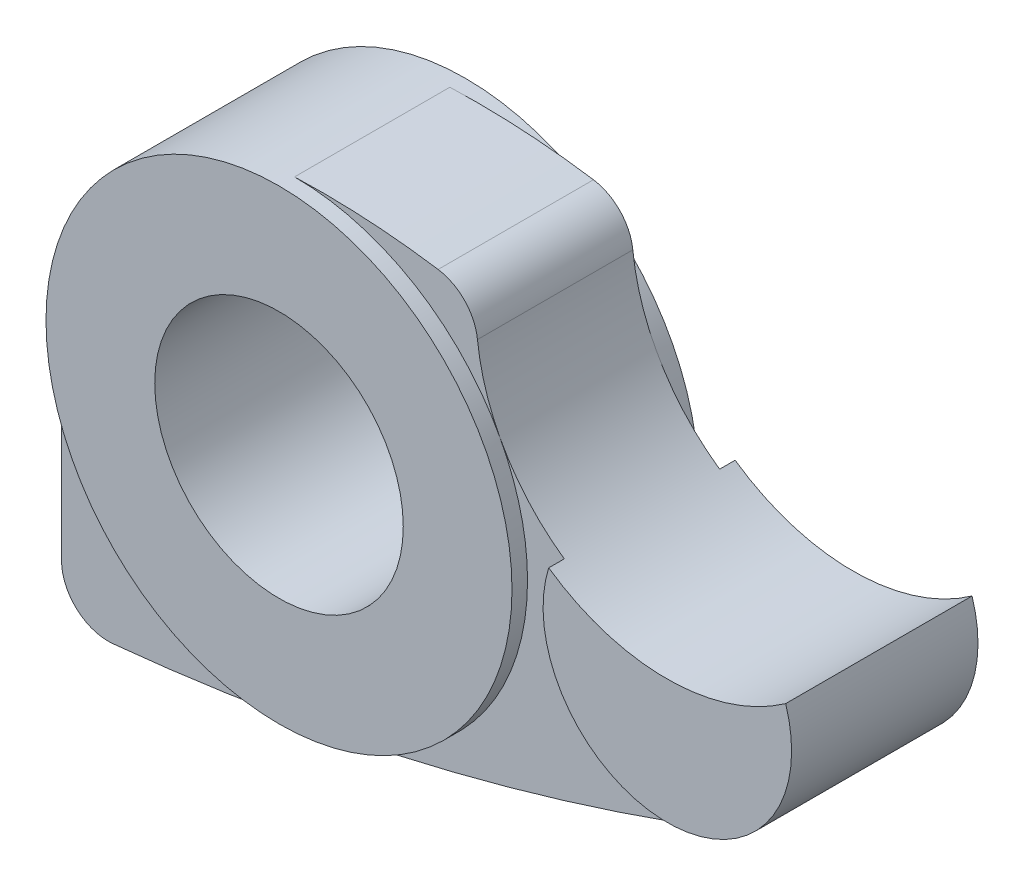
ISO-10303-21;
HEADER;
FILE_DESCRIPTION(('STEP AP214'),'2;1');
FILE_NAME('part.step','',(''),(''),'','','');
FILE_SCHEMA(('AUTOMOTIVE_DESIGN { 1 0 10303 214 1 1 1 1 }'));
ENDSEC;
DATA;
#1=APPLICATION_CONTEXT('core data for automotive mechanical design processes');
#2=APPLICATION_PROTOCOL_DEFINITION('international standard','automotive_design',2000,#1);
#3=PRODUCT_CONTEXT('',#1,'mechanical');
#4=PRODUCT('Part','Part','',(#3));
#5=PRODUCT_RELATED_PRODUCT_CATEGORY('part','',(#4));
#6=PRODUCT_DEFINITION_FORMATION('','',#4);
#7=PRODUCT_DEFINITION_CONTEXT('part definition',#1,'design');
#8=PRODUCT_DEFINITION('design','',#6,#7);
#9=PRODUCT_DEFINITION_SHAPE('','',#8);
#10=(LENGTH_UNIT() NAMED_UNIT(*) SI_UNIT(.MILLI.,.METRE.));
#11=(NAMED_UNIT(*) PLANE_ANGLE_UNIT() SI_UNIT($,.RADIAN.));
#12=(NAMED_UNIT(*) SI_UNIT($,.STERADIAN.) SOLID_ANGLE_UNIT());
#13=UNCERTAINTY_MEASURE_WITH_UNIT(LENGTH_MEASURE(1.E-05),#10,'distance_accuracy_value','');
#14=(GEOMETRIC_REPRESENTATION_CONTEXT(3) GLOBAL_UNCERTAINTY_ASSIGNED_CONTEXT((#13)) GLOBAL_UNIT_ASSIGNED_CONTEXT((#10,
#11,#12)) REPRESENTATION_CONTEXT('',''));
#15=CARTESIAN_POINT('',(0.,0.,0.));
#16=DIRECTION('',(0.,0.,1.));
#17=DIRECTION('',(1.,0.,0.));
#18=AXIS2_PLACEMENT_3D('',#15,#16,#17);
#19=CARTESIAN_POINT('',(0.,0.,6.));
#20=DIRECTION('',(0.,0.,1.));
#21=DIRECTION('',(1.,0.,0.));
#22=AXIS2_PLACEMENT_3D('',#19,#20,#21);
#23=PLANE('',#22);
#24=CARTESIAN_POINT('',(0.,0.,6.));
#25=DIRECTION('',(0.,0.,1.));
#26=DIRECTION('',(1.,0.,0.));
#27=AXIS2_PLACEMENT_3D('',#24,#25,#26);
#28=CIRCLE('',#27,15.);
#29=CARTESIAN_POINT('',(15.,0.,6.));
#30=VERTEX_POINT('',#29);
#31=EDGE_CURVE('E12',#30,#30,#28,.T.);
#32=ORIENTED_EDGE('',*,*,#31,.T.);
#33=EDGE_LOOP('',(#32));
#34=FACE_BOUND('',#33,.T.);
#35=CARTESIAN_POINT('',(0.,0.,6.));
#36=DIRECTION('',(0.,0.,1.));
#37=DIRECTION('',(1.,0.,0.));
#38=AXIS2_PLACEMENT_3D('',#35,#36,#37);
#39=CIRCLE('',#38,8.);
#40=CARTESIAN_POINT('',(8.,0.,6.));
#41=VERTEX_POINT('',#40);
#42=EDGE_CURVE('E257',#41,#41,#39,.T.);
#43=ORIENTED_EDGE('',*,*,#42,.F.);
#44=EDGE_LOOP('',(#43));
#45=FACE_BOUND('',#44,.T.);
#46=ADVANCED_FACE('F65',(#34,#45),#23,.T.);
#47=CARTESIAN_POINT('',(0.,0.,-6.));
#48=DIRECTION('',(0.,0.,1.));
#49=DIRECTION('',(1.,0.,0.));
#50=AXIS2_PLACEMENT_3D('',#47,#48,#49);
#51=PLANE('',#50);
#52=CARTESIAN_POINT('',(0.,0.,-6.));
#53=DIRECTION('',(0.,0.,1.));
#54=DIRECTION('',(1.,0.,0.));
#55=AXIS2_PLACEMENT_3D('',#52,#53,#54);
#56=CIRCLE('',#55,15.);
#57=CARTESIAN_POINT('',(15.,0.,-6.));
#58=VERTEX_POINT('',#57);
#59=EDGE_CURVE('E69',#58,#58,#56,.T.);
#60=ORIENTED_EDGE('',*,*,#59,.F.);
#61=EDGE_LOOP('',(#60));
#62=FACE_BOUND('',#61,.T.);
#63=CARTESIAN_POINT('',(0.,0.,-6.));
#64=DIRECTION('',(0.,0.,1.));
#65=DIRECTION('',(1.,0.,0.));
#66=AXIS2_PLACEMENT_3D('',#63,#64,#65);
#67=CIRCLE('',#66,8.);
#68=CARTESIAN_POINT('',(8.,0.,-6.));
#69=VERTEX_POINT('',#68);
#70=EDGE_CURVE('E256',#69,#69,#67,.T.);
#71=ORIENTED_EDGE('',*,*,#70,.T.);
#72=EDGE_LOOP('',(#71));
#73=FACE_BOUND('',#72,.T.);
#74=ADVANCED_FACE('F263',(#62,#73),#51,.F.);
#75=CARTESIAN_POINT('',(0.,0.,6.));
#76=DIRECTION('',(0.,0.,-1.));
#77=DIRECTION('',(-1.,0.,0.));
#78=AXIS2_PLACEMENT_3D('',#75,#76,#77);
#79=CYLINDRICAL_SURFACE('',#78,15.);
#80=CARTESIAN_POINT('',(0.,0.,5.));
#81=DIRECTION('',(0.,0.,1.));
#82=DIRECTION('',(1.,0.,0.));
#83=AXIS2_PLACEMENT_3D('',#80,#81,#82);
#84=CIRCLE('',#83,15.);
#85=CARTESIAN_POINT('',(2.91999999999998,-14.713041833693,5.));
#86=VERTEX_POINT('',#85);
#87=CARTESIAN_POINT('',(13.2477876106195,7.03534813807513,5.));
#88=VERTEX_POINT('',#87);
#89=EDGE_CURVE('E234',#86,#88,#84,.T.);
#90=ORIENTED_EDGE('',*,*,#89,.T.);
#91=CARTESIAN_POINT('',(0.,0.,5.));
#92=DIRECTION('',(0.,0.,1.));
#93=DIRECTION('',(1.,0.,0.));
#94=AXIS2_PLACEMENT_3D('',#91,#92,#93);
#95=CIRCLE('',#94,15.);
#96=CARTESIAN_POINT('',(0.,15.,5.));
#97=VERTEX_POINT('',#96);
#98=EDGE_CURVE('E80',#88,#97,#95,.T.);
#99=ORIENTED_EDGE('',*,*,#98,.T.);
#100=DIRECTION('',(0.,0.,-1.));
#101=VECTOR('',#100,1.);
#102=CARTESIAN_POINT('',(0.,15.,5.));
#103=LINE('',#102,#101);
#104=CARTESIAN_POINT('',(0.,15.,-5.));
#105=VERTEX_POINT('',#104);
#106=EDGE_CURVE('E85',#97,#105,#103,.T.);
#107=ORIENTED_EDGE('',*,*,#106,.T.);
#108=CARTESIAN_POINT('',(0.,0.,-5.));
#109=DIRECTION('',(0.,0.,1.));
#110=DIRECTION('',(1.,0.,0.));
#111=AXIS2_PLACEMENT_3D('',#108,#109,#110);
#112=CIRCLE('',#111,15.);
#113=CARTESIAN_POINT('',(13.2477876106195,7.03534813807514,-5.));
#114=VERTEX_POINT('',#113);
#115=EDGE_CURVE('E176',#114,#105,#112,.T.);
#116=ORIENTED_EDGE('',*,*,#115,.F.);
#117=CARTESIAN_POINT('',(0.,0.,-5.));
#118=DIRECTION('',(0.,0.,1.));
#119=DIRECTION('',(1.,0.,0.));
#120=AXIS2_PLACEMENT_3D('',#117,#118,#119);
#121=CIRCLE('',#120,15.);
#122=CARTESIAN_POINT('',(2.91999999999999,-14.713041833693,-5.));
#123=VERTEX_POINT('',#122);
#124=EDGE_CURVE('E233',#123,#114,#121,.T.);
#125=ORIENTED_EDGE('',*,*,#124,.F.);
#126=CARTESIAN_POINT('',(0.,0.,-5.));
#127=DIRECTION('',(0.,0.,1.));
#128=DIRECTION('',(1.,0.,0.));
#129=AXIS2_PLACEMENT_3D('',#126,#127,#128);
#130=CIRCLE('',#129,15.);
#131=CARTESIAN_POINT('',(-15.,0.,-5.));
#132=VERTEX_POINT('',#131);
#133=EDGE_CURVE('E194',#132,#123,#130,.T.);
#134=ORIENTED_EDGE('',*,*,#133,.F.);
#135=DIRECTION('',(0.,0.,-1.));
#136=VECTOR('',#135,1.);
#137=CARTESIAN_POINT('',(-15.,0.,5.));
#138=LINE('',#137,#136);
#139=CARTESIAN_POINT('',(-15.,0.,5.));
#140=VERTEX_POINT('',#139);
#141=EDGE_CURVE('E201',#140,#132,#138,.T.);
#142=ORIENTED_EDGE('',*,*,#141,.F.);
#143=CARTESIAN_POINT('',(0.,0.,5.));
#144=DIRECTION('',(0.,0.,1.));
#145=DIRECTION('',(1.,0.,0.));
#146=AXIS2_PLACEMENT_3D('',#143,#144,#145);
#147=CIRCLE('',#146,15.);
#148=EDGE_CURVE('E198',#140,#86,#147,.T.);
#149=ORIENTED_EDGE('',*,*,#148,.T.);
#150=EDGE_LOOP('',(#90,#99,#107,#116,#125,#134,#142,#149));
#151=FACE_BOUND('',#150,.T.);
#152=ORIENTED_EDGE('',*,*,#31,.F.);
#153=EDGE_LOOP('',(#152));
#154=FACE_BOUND('',#153,.T.);
#155=ORIENTED_EDGE('',*,*,#59,.T.);
#156=EDGE_LOOP('',(#155));
#157=FACE_BOUND('',#156,.T.);
#158=ADVANCED_FACE('F67',(#151,#154,#157),#79,.T.);
#159=CARTESIAN_POINT('',(0.,0.,6.));
#160=DIRECTION('',(0.,0.,-1.));
#161=DIRECTION('',(-1.,0.,0.));
#162=AXIS2_PLACEMENT_3D('',#159,#160,#161);
#163=CYLINDRICAL_SURFACE('',#162,8.);
#164=ORIENTED_EDGE('',*,*,#42,.T.);
#165=EDGE_LOOP('',(#164));
#166=FACE_BOUND('',#165,.T.);
#167=ORIENTED_EDGE('',*,*,#70,.F.);
#168=EDGE_LOOP('',(#167));
#169=FACE_BOUND('',#168,.T.);
#170=ADVANCED_FACE('F265',(#166,#169),#163,.F.);
#171=CARTESIAN_POINT('',(-26.2799999999999,132.417376503237,5.));
#172=DIRECTION('',(0.,0.,-1.));
#173=DIRECTION('',(-1.,0.,0.));
#174=AXIS2_PLACEMENT_3D('',#171,#172,#173);
#175=CYLINDRICAL_SURFACE('',#174,150.);
#176=CARTESIAN_POINT('',(-26.2799999999999,132.417376503237,-5.));
#177=DIRECTION('',(0.,0.,1.));
#178=DIRECTION('',(1.,0.,0.));
#179=AXIS2_PLACEMENT_3D('',#176,#177,#178);
#180=CIRCLE('',#179,150.);
#181=CARTESIAN_POINT('',(27.889014084507,-7.46013388750627,-5.));
#182=VERTEX_POINT('',#181);
#183=EDGE_CURVE('E247',#123,#182,#180,.T.);
#184=ORIENTED_EDGE('',*,*,#183,.T.);
#185=DIRECTION('',(0.,0.,-1.));
#186=VECTOR('',#185,1.);
#187=CARTESIAN_POINT('',(27.889014084507,-7.46013388750627,5.));
#188=LINE('',#187,#186);
#189=CARTESIAN_POINT('',(27.8890140845071,-7.46013388750624,5.));
#190=VERTEX_POINT('',#189);
#191=EDGE_CURVE('E244',#190,#182,#188,.T.);
#192=ORIENTED_EDGE('',*,*,#191,.F.);
#193=CARTESIAN_POINT('',(-26.2799999999999,132.417376503237,5.));
#194=DIRECTION('',(0.,0.,1.));
#195=DIRECTION('',(1.,0.,0.));
#196=AXIS2_PLACEMENT_3D('',#193,#194,#195);
#197=CIRCLE('',#196,150.);
#198=EDGE_CURVE('E236',#86,#190,#197,.T.);
#199=ORIENTED_EDGE('',*,*,#198,.F.);
#200=CARTESIAN_POINT('',(-26.2799999999999,132.417376503237,5.));
#201=DIRECTION('',(0.,0.,1.));
#202=DIRECTION('',(1.,0.,0.));
#203=AXIS2_PLACEMENT_3D('',#200,#201,#202);
#204=CIRCLE('',#203,150.);
#205=CARTESIAN_POINT('',(-11.7085714285714,-16.8731907452927,5.));
#206=VERTEX_POINT('',#205);
#207=EDGE_CURVE('E196',#206,#86,#204,.T.);
#208=ORIENTED_EDGE('',*,*,#207,.F.);
#209=DIRECTION('',(0.,0.,-1.));
#210=VECTOR('',#209,1.);
#211=CARTESIAN_POINT('',(-11.7085714285714,-16.8731907452927,5.));
#212=LINE('',#211,#210);
#213=CARTESIAN_POINT('',(-11.7085714285714,-16.8731907452927,-5.));
#214=VERTEX_POINT('',#213);
#215=EDGE_CURVE('E211',#206,#214,#212,.T.);
#216=ORIENTED_EDGE('',*,*,#215,.T.);
#217=CARTESIAN_POINT('',(-26.2799999999999,132.417376503237,-5.));
#218=DIRECTION('',(0.,0.,1.));
#219=DIRECTION('',(1.,0.,0.));
#220=AXIS2_PLACEMENT_3D('',#217,#218,#219);
#221=CIRCLE('',#220,150.);
#222=EDGE_CURVE('E206',#214,#123,#221,.T.);
#223=ORIENTED_EDGE('',*,*,#222,.T.);
#224=EDGE_LOOP('',(#184,#192,#199,#208,#216,#223));
#225=FACE_BOUND('',#224,.T.);
#226=ADVANCED_FACE('F267',(#225),#175,.T.);
#227=CARTESIAN_POINT('',(24.95,13.2499056600415,5.));
#228=DIRECTION('',(0.,0.,-1.));
#229=DIRECTION('',(-1.,0.,0.));
#230=AXIS2_PLACEMENT_3D('',#227,#228,#229);
#231=CYLINDRICAL_SURFACE('',#230,13.25);
#232=CARTESIAN_POINT('',(24.95,13.2499056600415,-5.));
#233=DIRECTION('',(0.,0.,1.));
#234=DIRECTION('',(1.,0.,0.));
#235=AXIS2_PLACEMENT_3D('',#232,#233,#234);
#236=CIRCLE('',#235,13.25);
#237=CARTESIAN_POINT('',(17.3641904918523,2.38629695454703,-5.));
#238=VERTEX_POINT('',#237);
#239=EDGE_CURVE('E237',#114,#238,#236,.T.);
#240=ORIENTED_EDGE('',*,*,#239,.F.);
#241=CARTESIAN_POINT('',(24.95,13.2499056600415,-5.));
#242=DIRECTION('',(0.,0.,1.));
#243=DIRECTION('',(1.,0.,0.));
#244=AXIS2_PLACEMENT_3D('',#241,#242,#243);
#245=CIRCLE('',#244,13.25);
#246=CARTESIAN_POINT('',(11.7772750679011,11.8209837366115,-5.));
#247=VERTEX_POINT('',#246);
#248=EDGE_CURVE('E161',#247,#114,#245,.T.);
#249=ORIENTED_EDGE('',*,*,#248,.F.);
#250=DIRECTION('',(0.,0.,-1.));
#251=VECTOR('',#250,1.);
#252=CARTESIAN_POINT('',(11.7772750679011,11.8209837366115,5.));
#253=LINE('',#252,#251);
#254=CARTESIAN_POINT('',(11.7772750679011,11.8209837366115,5.));
#255=VERTEX_POINT('',#254);
#256=EDGE_CURVE('E154',#255,#247,#253,.T.);
#257=ORIENTED_EDGE('',*,*,#256,.F.);
#258=CARTESIAN_POINT('',(24.95,13.2499056600415,5.));
#259=DIRECTION('',(0.,0.,1.));
#260=DIRECTION('',(1.,0.,0.));
#261=AXIS2_PLACEMENT_3D('',#258,#259,#260);
#262=CIRCLE('',#261,13.25);
#263=EDGE_CURVE('E159',#255,#88,#262,.T.);
#264=ORIENTED_EDGE('',*,*,#263,.T.);
#265=CARTESIAN_POINT('',(24.95,13.2499056600415,5.));
#266=DIRECTION('',(0.,0.,1.));
#267=DIRECTION('',(1.,0.,0.));
#268=AXIS2_PLACEMENT_3D('',#265,#266,#267);
#269=CIRCLE('',#268,13.25);
#270=CARTESIAN_POINT('',(17.3641904918523,2.38629695454703,5.));
#271=VERTEX_POINT('',#270);
#272=EDGE_CURVE('E242',#88,#271,#269,.T.);
#273=ORIENTED_EDGE('',*,*,#272,.T.);
#274=DIRECTION('',(0.,0.,-1.));
#275=VECTOR('',#274,1.);
#276=CARTESIAN_POINT('',(17.3641904918523,2.38629695454703,6.));
#277=LINE('',#276,#275);
#278=CARTESIAN_POINT('',(17.3641904918523,2.38629695454703,6.));
#279=VERTEX_POINT('',#278);
#280=EDGE_CURVE('E231',#279,#271,#277,.T.);
#281=ORIENTED_EDGE('',*,*,#280,.F.);
#282=CARTESIAN_POINT('',(24.95,13.2499056600415,6.));
#283=DIRECTION('',(0.,0.,1.));
#284=DIRECTION('',(1.,0.,0.));
#285=AXIS2_PLACEMENT_3D('',#282,#283,#284);
#286=CIRCLE('',#285,13.25);
#287=CARTESIAN_POINT('',(32.6175823810563,2.44385733376998,6.));
#288=VERTEX_POINT('',#287);
#289=EDGE_CURVE('E218',#279,#288,#286,.T.);
#290=ORIENTED_EDGE('',*,*,#289,.T.);
#291=DIRECTION('',(0.,0.,-1.));
#292=VECTOR('',#291,1.);
#293=CARTESIAN_POINT('',(32.6175823810563,2.44385733376998,6.));
#294=LINE('',#293,#292);
#295=CARTESIAN_POINT('',(32.6175823810563,2.44385733376998,-6.));
#296=VERTEX_POINT('',#295);
#297=EDGE_CURVE('E224',#288,#296,#294,.T.);
#298=ORIENTED_EDGE('',*,*,#297,.T.);
#299=CARTESIAN_POINT('',(24.95,13.2499056600415,-6.));
#300=DIRECTION('',(0.,0.,1.));
#301=DIRECTION('',(1.,0.,0.));
#302=AXIS2_PLACEMENT_3D('',#299,#300,#301);
#303=CIRCLE('',#302,13.25);
#304=CARTESIAN_POINT('',(17.3641904918523,2.38629695454703,-6.));
#305=VERTEX_POINT('',#304);
#306=EDGE_CURVE('E217',#305,#296,#303,.T.);
#307=ORIENTED_EDGE('',*,*,#306,.F.);
#308=EDGE_CURVE('E230',#238,#305,#277,.T.);
#309=ORIENTED_EDGE('',*,*,#308,.F.);
#310=EDGE_LOOP('',(#240,#249,#257,#264,#273,#281,#290,#298,#307,#309));
#311=FACE_BOUND('',#310,.T.);
#312=ADVANCED_FACE('F156',(#311),#231,.F.);
#313=CARTESIAN_POINT('',(0.,0.,5.));
#314=DIRECTION('',(0.,0.,1.));
#315=DIRECTION('',(1.,0.,0.));
#316=AXIS2_PLACEMENT_3D('',#313,#314,#315);
#317=PLANE('',#316);
#318=ORIENTED_EDGE('',*,*,#89,.F.);
#319=ORIENTED_EDGE('',*,*,#198,.T.);
#320=CARTESIAN_POINT('',(25.,0.,5.));
#321=DIRECTION('',(0.,0.,1.));
#322=DIRECTION('',(1.,0.,0.));
#323=AXIS2_PLACEMENT_3D('',#320,#321,#322);
#324=CIRCLE('',#323,8.);
#325=EDGE_CURVE('E240',#271,#190,#324,.T.);
#326=ORIENTED_EDGE('',*,*,#325,.F.);
#327=ORIENTED_EDGE('',*,*,#272,.F.);
#328=EDGE_LOOP('',(#318,#319,#326,#327));
#329=FACE_BOUND('',#328,.T.);
#330=ADVANCED_FACE('F345',(#329),#317,.T.);
#331=CARTESIAN_POINT('',(0.,0.,-5.));
#332=DIRECTION('',(0.,0.,1.));
#333=DIRECTION('',(1.,0.,0.));
#334=AXIS2_PLACEMENT_3D('',#331,#332,#333);
#335=PLANE('',#334);
#336=ORIENTED_EDGE('',*,*,#124,.T.);
#337=ORIENTED_EDGE('',*,*,#239,.T.);
#338=CARTESIAN_POINT('',(25.,0.,-5.));
#339=DIRECTION('',(0.,0.,1.));
#340=DIRECTION('',(1.,0.,0.));
#341=AXIS2_PLACEMENT_3D('',#338,#339,#340);
#342=CIRCLE('',#341,8.);
#343=EDGE_CURVE('E250',#238,#182,#342,.T.);
#344=ORIENTED_EDGE('',*,*,#343,.T.);
#345=ORIENTED_EDGE('',*,*,#183,.F.);
#346=EDGE_LOOP('',(#336,#337,#344,#345));
#347=FACE_BOUND('',#346,.T.);
#348=ADVANCED_FACE('F317',(#347),#335,.F.);
#349=CARTESIAN_POINT('',(25.,0.,6.));
#350=DIRECTION('',(0.,0.,-1.));
#351=DIRECTION('',(-1.,0.,0.));
#352=AXIS2_PLACEMENT_3D('',#349,#350,#351);
#353=CYLINDRICAL_SURFACE('',#352,8.);
#354=ORIENTED_EDGE('',*,*,#325,.T.);
#355=ORIENTED_EDGE('',*,*,#191,.T.);
#356=ORIENTED_EDGE('',*,*,#343,.F.);
#357=ORIENTED_EDGE('',*,*,#308,.T.);
#358=CARTESIAN_POINT('',(25.,0.,-6.));
#359=DIRECTION('',(0.,0.,1.));
#360=DIRECTION('',(1.,0.,0.));
#361=AXIS2_PLACEMENT_3D('',#358,#359,#360);
#362=CIRCLE('',#361,8.);
#363=EDGE_CURVE('E222',#305,#296,#362,.T.);
#364=ORIENTED_EDGE('',*,*,#363,.T.);
#365=ORIENTED_EDGE('',*,*,#297,.F.);
#366=CARTESIAN_POINT('',(25.,0.,6.));
#367=DIRECTION('',(0.,0.,1.));
#368=DIRECTION('',(1.,0.,0.));
#369=AXIS2_PLACEMENT_3D('',#366,#367,#368);
#370=CIRCLE('',#369,8.);
#371=EDGE_CURVE('E221',#279,#288,#370,.T.);
#372=ORIENTED_EDGE('',*,*,#371,.F.);
#373=ORIENTED_EDGE('',*,*,#280,.T.);
#374=EDGE_LOOP('',(#354,#355,#356,#357,#364,#365,#372,#373));
#375=FACE_BOUND('',#374,.T.);
#376=ADVANCED_FACE('F311',(#375),#353,.T.);
#377=CARTESIAN_POINT('',(0.,0.,6.));
#378=DIRECTION('',(0.,0.,1.));
#379=DIRECTION('',(1.,0.,0.));
#380=AXIS2_PLACEMENT_3D('',#377,#378,#379);
#381=PLANE('',#380);
#382=ORIENTED_EDGE('',*,*,#289,.F.);
#383=ORIENTED_EDGE('',*,*,#371,.T.);
#384=EDGE_LOOP('',(#382,#383));
#385=FACE_BOUND('',#384,.T.);
#386=ADVANCED_FACE('F316',(#385),#381,.T.);
#387=CARTESIAN_POINT('',(0.,0.,-6.));
#388=DIRECTION('',(0.,0.,1.));
#389=DIRECTION('',(1.,0.,0.));
#390=AXIS2_PLACEMENT_3D('',#387,#388,#389);
#391=PLANE('',#390);
#392=ORIENTED_EDGE('',*,*,#306,.T.);
#393=ORIENTED_EDGE('',*,*,#363,.F.);
#394=EDGE_LOOP('',(#392,#393));
#395=FACE_BOUND('',#394,.T.);
#396=ADVANCED_FACE('F326',(#395),#391,.F.);
#397=CARTESIAN_POINT('',(-15.,0.,5.));
#398=DIRECTION('',(1.,0.,0.));
#399=DIRECTION('',(0.,1.,0.));
#400=AXIS2_PLACEMENT_3D('',#397,#398,#399);
#401=PLANE('',#400);
#402=DIRECTION('',(0.,-1.,0.));
#403=VECTOR('',#402,1.);
#404=CARTESIAN_POINT('',(-15.,0.,-5.));
#405=LINE('',#404,#403);
#406=CARTESIAN_POINT('',(-15.,-13.8873794003221,-5.));
#407=VERTEX_POINT('',#406);
#408=EDGE_CURVE('E164',#132,#407,#405,.T.);
#409=ORIENTED_EDGE('',*,*,#408,.T.);
#410=DIRECTION('',(0.,0.,-1.));
#411=VECTOR('',#410,1.);
#412=CARTESIAN_POINT('',(-15.,-13.8873794003221,5.));
#413=LINE('',#412,#411);
#414=CARTESIAN_POINT('',(-15.,-13.8873794003221,5.));
#415=VERTEX_POINT('',#414);
#416=EDGE_CURVE('E214',#415,#407,#413,.T.);
#417=ORIENTED_EDGE('',*,*,#416,.F.);
#418=DIRECTION('',(0.,-1.,0.));
#419=VECTOR('',#418,1.);
#420=CARTESIAN_POINT('',(-15.,0.,5.));
#421=LINE('',#420,#419);
#422=EDGE_CURVE('E190',#140,#415,#421,.T.);
#423=ORIENTED_EDGE('',*,*,#422,.F.);
#424=ORIENTED_EDGE('',*,*,#141,.T.);
#425=EDGE_LOOP('',(#409,#417,#423,#424));
#426=FACE_BOUND('',#425,.T.);
#427=ADVANCED_FACE('F335',(#426),#401,.F.);
#428=CARTESIAN_POINT('',(-12.,-13.8873794003221,5.));
#429=DIRECTION('',(0.,0.,-1.));
#430=DIRECTION('',(-1.,0.,0.));
#431=AXIS2_PLACEMENT_3D('',#428,#429,#430);
#432=CYLINDRICAL_SURFACE('',#431,3.);
#433=CARTESIAN_POINT('',(-12.,-13.8873794003221,-5.));
#434=DIRECTION('',(0.,0.,1.));
#435=DIRECTION('',(1.,0.,0.));
#436=AXIS2_PLACEMENT_3D('',#433,#434,#435);
#437=CIRCLE('',#436,3.);
#438=EDGE_CURVE('E204',#407,#214,#437,.T.);
#439=ORIENTED_EDGE('',*,*,#438,.T.);
#440=ORIENTED_EDGE('',*,*,#215,.F.);
#441=CARTESIAN_POINT('',(-12.,-13.8873794003221,5.));
#442=DIRECTION('',(0.,0.,1.));
#443=DIRECTION('',(1.,0.,0.));
#444=AXIS2_PLACEMENT_3D('',#441,#442,#443);
#445=CIRCLE('',#444,3.);
#446=EDGE_CURVE('E193',#415,#206,#445,.T.);
#447=ORIENTED_EDGE('',*,*,#446,.F.);
#448=ORIENTED_EDGE('',*,*,#416,.T.);
#449=EDGE_LOOP('',(#439,#440,#447,#448));
#450=FACE_BOUND('',#449,.T.);
#451=ADVANCED_FACE('F385',(#450),#432,.T.);
#452=CARTESIAN_POINT('',(0.,0.,5.));
#453=DIRECTION('',(0.,0.,1.));
#454=DIRECTION('',(1.,0.,0.));
#455=AXIS2_PLACEMENT_3D('',#452,#453,#454);
#456=PLANE('',#455);
#457=ORIENTED_EDGE('',*,*,#422,.T.);
#458=ORIENTED_EDGE('',*,*,#446,.T.);
#459=ORIENTED_EDGE('',*,*,#207,.T.);
#460=ORIENTED_EDGE('',*,*,#148,.F.);
#461=EDGE_LOOP('',(#457,#458,#459,#460));
#462=FACE_BOUND('',#461,.T.);
#463=ADVANCED_FACE('F394',(#462),#456,.T.);
#464=CARTESIAN_POINT('',(0.,0.,-5.));
#465=DIRECTION('',(0.,0.,1.));
#466=DIRECTION('',(1.,0.,0.));
#467=AXIS2_PLACEMENT_3D('',#464,#465,#466);
#468=PLANE('',#467);
#469=ORIENTED_EDGE('',*,*,#408,.F.);
#470=ORIENTED_EDGE('',*,*,#133,.T.);
#471=ORIENTED_EDGE('',*,*,#222,.F.);
#472=ORIENTED_EDGE('',*,*,#438,.F.);
#473=EDGE_LOOP('',(#469,#470,#471,#472));
#474=FACE_BOUND('',#473,.T.);
#475=ADVANCED_FACE('F403',(#474),#468,.F.);
#476=CARTESIAN_POINT('',(8.79477130968997,11.4974542445141,5.));
#477=DIRECTION('',(0.,0.,-1.));
#478=DIRECTION('',(-1.,0.,0.));
#479=AXIS2_PLACEMENT_3D('',#476,#477,#478);
#480=CYLINDRICAL_SURFACE('',#479,3.);
#481=CARTESIAN_POINT('',(8.79477130968997,11.4974542445141,-5.));
#482=DIRECTION('',(0.,0.,1.));
#483=DIRECTION('',(1.,0.,0.));
#484=AXIS2_PLACEMENT_3D('',#481,#482,#483);
#485=CIRCLE('',#484,3.);
#486=CARTESIAN_POINT('',(9.24519508911452,14.4634479091953,-5.));
#487=VERTEX_POINT('',#486);
#488=EDGE_CURVE('E185',#247,#487,#485,.T.);
#489=ORIENTED_EDGE('',*,*,#488,.T.);
#490=DIRECTION('',(0.,0.,-1.));
#491=VECTOR('',#490,1.);
#492=CARTESIAN_POINT('',(9.24519508911452,14.4634479091953,5.));
#493=LINE('',#492,#491);
#494=CARTESIAN_POINT('',(9.24519508911452,14.4634479091953,5.));
#495=VERTEX_POINT('',#494);
#496=EDGE_CURVE('E165',#495,#487,#493,.T.);
#497=ORIENTED_EDGE('',*,*,#496,.F.);
#498=CARTESIAN_POINT('',(8.79477130968997,11.4974542445141,5.));
#499=DIRECTION('',(0.,0.,1.));
#500=DIRECTION('',(1.,0.,0.));
#501=AXIS2_PLACEMENT_3D('',#498,#499,#500);
#502=CIRCLE('',#501,3.);
#503=EDGE_CURVE('E168',#255,#495,#502,.T.);
#504=ORIENTED_EDGE('',*,*,#503,.F.);
#505=ORIENTED_EDGE('',*,*,#256,.T.);
#506=EDGE_LOOP('',(#489,#497,#504,#505));
#507=FACE_BOUND('',#506,.T.);
#508=ADVANCED_FACE('F169',(#507),#480,.T.);
#509=CARTESIAN_POINT('',(1.73813209870536,-34.9697798354911,5.));
#510=DIRECTION('',(0.,0.,-1.));
#511=DIRECTION('',(-1.,0.,0.));
#512=AXIS2_PLACEMENT_3D('',#509,#510,#511);
#513=CYLINDRICAL_SURFACE('',#512,50.);
#514=CARTESIAN_POINT('',(1.73813209870536,-34.9697798354911,-5.));
#515=DIRECTION('',(0.,0.,1.));
#516=DIRECTION('',(1.,0.,0.));
#517=AXIS2_PLACEMENT_3D('',#514,#515,#516);
#518=CIRCLE('',#517,50.);
#519=EDGE_CURVE('E179',#487,#105,#518,.T.);
#520=ORIENTED_EDGE('',*,*,#519,.T.);
#521=ORIENTED_EDGE('',*,*,#106,.F.);
#522=CARTESIAN_POINT('',(1.73813209870536,-34.9697798354911,5.));
#523=DIRECTION('',(0.,0.,1.));
#524=DIRECTION('',(1.,0.,0.));
#525=AXIS2_PLACEMENT_3D('',#522,#523,#524);
#526=CIRCLE('',#525,50.);
#527=EDGE_CURVE('E173',#495,#97,#526,.T.);
#528=ORIENTED_EDGE('',*,*,#527,.F.);
#529=ORIENTED_EDGE('',*,*,#496,.T.);
#530=EDGE_LOOP('',(#520,#521,#528,#529));
#531=FACE_BOUND('',#530,.T.);
#532=ADVANCED_FACE('F420',(#531),#513,.T.);
#533=CARTESIAN_POINT('',(0.,0.,5.));
#534=DIRECTION('',(0.,0.,1.));
#535=DIRECTION('',(1.,0.,0.));
#536=AXIS2_PLACEMENT_3D('',#533,#534,#535);
#537=PLANE('',#536);
#538=ORIENTED_EDGE('',*,*,#263,.F.);
#539=ORIENTED_EDGE('',*,*,#503,.T.);
#540=ORIENTED_EDGE('',*,*,#527,.T.);
#541=ORIENTED_EDGE('',*,*,#98,.F.);
#542=EDGE_LOOP('',(#538,#539,#540,#541));
#543=FACE_BOUND('',#542,.T.);
#544=ADVANCED_FACE('F175',(#543),#537,.T.);
#545=CARTESIAN_POINT('',(0.,0.,-5.));
#546=DIRECTION('',(0.,0.,1.));
#547=DIRECTION('',(1.,0.,0.));
#548=AXIS2_PLACEMENT_3D('',#545,#546,#547);
#549=PLANE('',#548);
#550=ORIENTED_EDGE('',*,*,#248,.T.);
#551=ORIENTED_EDGE('',*,*,#115,.T.);
#552=ORIENTED_EDGE('',*,*,#519,.F.);
#553=ORIENTED_EDGE('',*,*,#488,.F.);
#554=EDGE_LOOP('',(#550,#551,#552,#553));
#555=FACE_BOUND('',#554,.T.);
#556=ADVANCED_FACE('F436',(#555),#549,.F.);
#557=CLOSED_SHELL('',(#46,#74,#158,#170,#226,#312,#330,#348,#376,#386,#396,#427,#451,#463,#475,
#508,#532,#544,#556));
#558=MANIFOLD_SOLID_BREP('B2',#557);
#559=ADVANCED_BREP_SHAPE_REPRESENTATION('',(#18,#558),#14);
#560=SHAPE_DEFINITION_REPRESENTATION(#9,#559);
ENDSEC;
END-ISO-10303-21;
